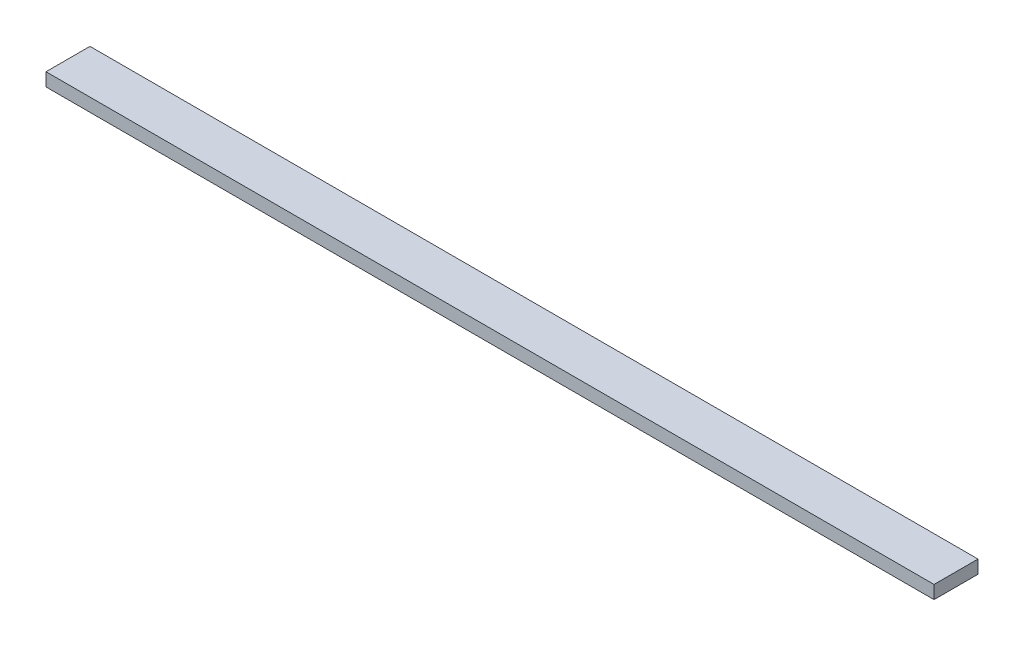
ISO-10303-21;
HEADER;
FILE_DESCRIPTION(('STEP AP214'),'2;1');
FILE_NAME('part.step','',(''),(''),'','','');
FILE_SCHEMA(('AUTOMOTIVE_DESIGN { 1 0 10303 214 1 1 1 1 }'));
ENDSEC;
DATA;
#1=APPLICATION_CONTEXT('core data for automotive mechanical design processes');
#2=APPLICATION_PROTOCOL_DEFINITION('international standard','automotive_design',2000,#1);
#3=PRODUCT_CONTEXT('',#1,'mechanical');
#4=PRODUCT('Part','Part','',(#3));
#5=PRODUCT_RELATED_PRODUCT_CATEGORY('part','',(#4));
#6=PRODUCT_DEFINITION_FORMATION('','',#4);
#7=PRODUCT_DEFINITION_CONTEXT('part definition',#1,'design');
#8=PRODUCT_DEFINITION('design','',#6,#7);
#9=PRODUCT_DEFINITION_SHAPE('','',#8);
#10=(LENGTH_UNIT() NAMED_UNIT(*) SI_UNIT(.MILLI.,.METRE.));
#11=(NAMED_UNIT(*) PLANE_ANGLE_UNIT() SI_UNIT($,.RADIAN.));
#12=(NAMED_UNIT(*) SI_UNIT($,.STERADIAN.) SOLID_ANGLE_UNIT());
#13=UNCERTAINTY_MEASURE_WITH_UNIT(LENGTH_MEASURE(1.E-05),#10,'distance_accuracy_value','');
#14=(GEOMETRIC_REPRESENTATION_CONTEXT(3) GLOBAL_UNCERTAINTY_ASSIGNED_CONTEXT((#13)) GLOBAL_UNIT_ASSIGNED_CONTEXT((#10,
#11,#12)) REPRESENTATION_CONTEXT('',''));
#15=CARTESIAN_POINT('',(0.,0.,0.));
#16=DIRECTION('',(0.,0.,1.));
#17=DIRECTION('',(1.,0.,0.));
#18=AXIS2_PLACEMENT_3D('',#15,#16,#17);
#19=CARTESIAN_POINT('',(101.,1.5,5.));
#20=DIRECTION('',(-1.,0.,0.));
#21=DIRECTION('',(0.,0.,1.));
#22=AXIS2_PLACEMENT_3D('',#19,#20,#21);
#23=PLANE('',#22);
#24=DIRECTION('',(0.,0.,-1.));
#25=VECTOR('',#24,1.);
#26=CARTESIAN_POINT('',(101.,-1.5,5.));
#27=LINE('',#26,#25);
#28=CARTESIAN_POINT('',(101.,-1.5,5.));
#29=VERTEX_POINT('',#28);
#30=CARTESIAN_POINT('',(101.,-1.5,-5.));
#31=VERTEX_POINT('',#30);
#32=EDGE_CURVE('E111',#29,#31,#27,.T.);
#33=ORIENTED_EDGE('',*,*,#32,.T.);
#34=DIRECTION('',(0.,-1.,0.));
#35=VECTOR('',#34,1.);
#36=CARTESIAN_POINT('',(101.,1.5,-5.));
#37=LINE('',#36,#35);
#38=CARTESIAN_POINT('',(101.,1.5,-5.));
#39=VERTEX_POINT('',#38);
#40=EDGE_CURVE('E11',#39,#31,#37,.T.);
#41=ORIENTED_EDGE('',*,*,#40,.F.);
#42=DIRECTION('',(0.,0.,-1.));
#43=VECTOR('',#42,1.);
#44=CARTESIAN_POINT('',(101.,1.5,5.));
#45=LINE('',#44,#43);
#46=CARTESIAN_POINT('',(101.,1.5,5.));
#47=VERTEX_POINT('',#46);
#48=EDGE_CURVE('E95',#47,#39,#45,.T.);
#49=ORIENTED_EDGE('',*,*,#48,.F.);
#50=DIRECTION('',(0.,-1.,0.));
#51=VECTOR('',#50,1.);
#52=CARTESIAN_POINT('',(101.,1.5,5.));
#53=LINE('',#52,#51);
#54=EDGE_CURVE('E107',#47,#29,#53,.T.);
#55=ORIENTED_EDGE('',*,*,#54,.T.);
#56=EDGE_LOOP('',(#33,#41,#49,#55));
#57=FACE_BOUND('',#56,.T.);
#58=ADVANCED_FACE('F43',(#57),#23,.F.);
#59=CARTESIAN_POINT('',(-101.,1.5,-5.));
#60=DIRECTION('',(0.,0.,1.));
#61=DIRECTION('',(1.,0.,0.));
#62=AXIS2_PLACEMENT_3D('',#59,#60,#61);
#63=PLANE('',#62);
#64=DIRECTION('',(-1.,0.,0.));
#65=VECTOR('',#64,1.);
#66=CARTESIAN_POINT('',(-101.,-1.5,-5.));
#67=LINE('',#66,#65);
#68=CARTESIAN_POINT('',(-101.,-1.5,-5.));
#69=VERTEX_POINT('',#68);
#70=EDGE_CURVE('E100',#31,#69,#67,.T.);
#71=ORIENTED_EDGE('',*,*,#70,.T.);
#72=DIRECTION('',(0.,-1.,0.));
#73=VECTOR('',#72,1.);
#74=CARTESIAN_POINT('',(-101.,1.5,-5.));
#75=LINE('',#74,#73);
#76=CARTESIAN_POINT('',(-101.,1.5,-5.));
#77=VERTEX_POINT('',#76);
#78=EDGE_CURVE('E52',#77,#69,#75,.T.);
#79=ORIENTED_EDGE('',*,*,#78,.F.);
#80=DIRECTION('',(-1.,0.,0.));
#81=VECTOR('',#80,1.);
#82=CARTESIAN_POINT('',(-101.,1.5,-5.));
#83=LINE('',#82,#81);
#84=EDGE_CURVE('E90',#39,#77,#83,.T.);
#85=ORIENTED_EDGE('',*,*,#84,.F.);
#86=ORIENTED_EDGE('',*,*,#40,.T.);
#87=EDGE_LOOP('',(#71,#79,#85,#86));
#88=FACE_BOUND('',#87,.T.);
#89=ADVANCED_FACE('F99',(#88),#63,.F.);
#90=CARTESIAN_POINT('',(-101.,1.5,5.));
#91=DIRECTION('',(1.,0.,0.));
#92=DIRECTION('',(0.,0.,-1.));
#93=AXIS2_PLACEMENT_3D('',#90,#91,#92);
#94=PLANE('',#93);
#95=DIRECTION('',(0.,0.,1.));
#96=VECTOR('',#95,1.);
#97=CARTESIAN_POINT('',(-101.,-1.5,5.));
#98=LINE('',#97,#96);
#99=CARTESIAN_POINT('',(-101.,-1.5,5.));
#100=VERTEX_POINT('',#99);
#101=EDGE_CURVE('E77',#69,#100,#98,.T.);
#102=ORIENTED_EDGE('',*,*,#101,.T.);
#103=DIRECTION('',(0.,-1.,0.));
#104=VECTOR('',#103,1.);
#105=CARTESIAN_POINT('',(-101.,1.5,5.));
#106=LINE('',#105,#104);
#107=CARTESIAN_POINT('',(-101.,1.5,5.));
#108=VERTEX_POINT('',#107);
#109=EDGE_CURVE('E102',#108,#100,#106,.T.);
#110=ORIENTED_EDGE('',*,*,#109,.F.);
#111=DIRECTION('',(0.,0.,1.));
#112=VECTOR('',#111,1.);
#113=CARTESIAN_POINT('',(-101.,1.5,5.));
#114=LINE('',#113,#112);
#115=EDGE_CURVE('E93',#77,#108,#114,.T.);
#116=ORIENTED_EDGE('',*,*,#115,.F.);
#117=ORIENTED_EDGE('',*,*,#78,.T.);
#118=EDGE_LOOP('',(#102,#110,#116,#117));
#119=FACE_BOUND('',#118,.T.);
#120=ADVANCED_FACE('F103',(#119),#94,.F.);
#121=CARTESIAN_POINT('',(-101.,1.5,5.));
#122=DIRECTION('',(0.,0.,-1.));
#123=DIRECTION('',(-1.,0.,0.));
#124=AXIS2_PLACEMENT_3D('',#121,#122,#123);
#125=PLANE('',#124);
#126=DIRECTION('',(1.,0.,0.));
#127=VECTOR('',#126,1.);
#128=CARTESIAN_POINT('',(-101.,-1.5,5.));
#129=LINE('',#128,#127);
#130=EDGE_CURVE('E83',#100,#29,#129,.T.);
#131=ORIENTED_EDGE('',*,*,#130,.T.);
#132=ORIENTED_EDGE('',*,*,#54,.F.);
#133=DIRECTION('',(1.,0.,0.));
#134=VECTOR('',#133,1.);
#135=CARTESIAN_POINT('',(-101.,1.5,5.));
#136=LINE('',#135,#134);
#137=EDGE_CURVE('E60',#108,#47,#136,.T.);
#138=ORIENTED_EDGE('',*,*,#137,.F.);
#139=ORIENTED_EDGE('',*,*,#109,.T.);
#140=EDGE_LOOP('',(#131,#132,#138,#139));
#141=FACE_BOUND('',#140,.T.);
#142=ADVANCED_FACE('F124',(#141),#125,.F.);
#143=CARTESIAN_POINT('',(0.,1.5,0.));
#144=DIRECTION('',(0.,-1.,0.));
#145=DIRECTION('',(0.,0.,-1.));
#146=AXIS2_PLACEMENT_3D('',#143,#144,#145);
#147=PLANE('',#146);
#148=ORIENTED_EDGE('',*,*,#48,.T.);
#149=ORIENTED_EDGE('',*,*,#84,.T.);
#150=ORIENTED_EDGE('',*,*,#115,.T.);
#151=ORIENTED_EDGE('',*,*,#137,.T.);
#152=EDGE_LOOP('',(#148,#149,#150,#151));
#153=FACE_BOUND('',#152,.T.);
#154=ADVANCED_FACE('F91',(#153),#147,.F.);
#155=CARTESIAN_POINT('',(0.,-1.5,0.));
#156=DIRECTION('',(0.,-1.,0.));
#157=DIRECTION('',(0.,0.,-1.));
#158=AXIS2_PLACEMENT_3D('',#155,#156,#157);
#159=PLANE('',#158);
#160=ORIENTED_EDGE('',*,*,#32,.F.);
#161=ORIENTED_EDGE('',*,*,#130,.F.);
#162=ORIENTED_EDGE('',*,*,#101,.F.);
#163=ORIENTED_EDGE('',*,*,#70,.F.);
#164=EDGE_LOOP('',(#160,#161,#162,#163));
#165=FACE_BOUND('',#164,.T.);
#166=ADVANCED_FACE('F127',(#165),#159,.T.);
#167=CLOSED_SHELL('',(#58,#89,#120,#142,#154,#166));
#168=MANIFOLD_SOLID_BREP('B2',#167);
#169=ADVANCED_BREP_SHAPE_REPRESENTATION('',(#18,#168),#14);
#170=SHAPE_DEFINITION_REPRESENTATION(#9,#169);
ENDSEC;
END-ISO-10303-21;
